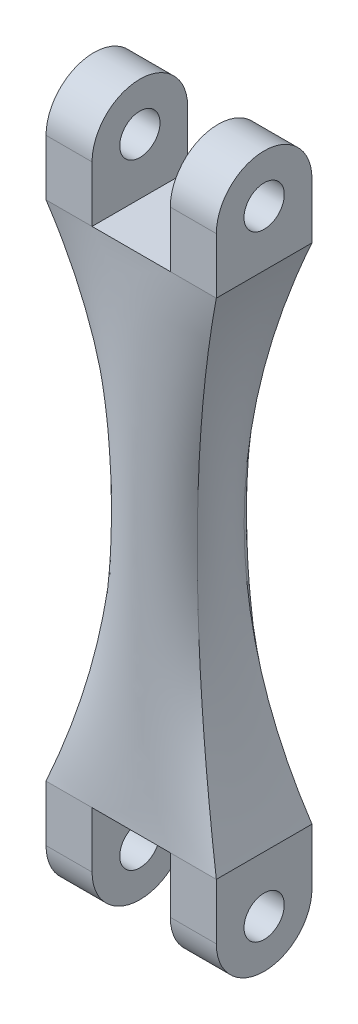
ISO-10303-21;
HEADER;
FILE_DESCRIPTION(('STEP AP214'),'2;1');
FILE_NAME('part.step','',(''),(''),'','','');
FILE_SCHEMA(('AUTOMOTIVE_DESIGN { 1 0 10303 214 1 1 1 1 }'));
ENDSEC;
DATA;
#1=APPLICATION_CONTEXT('core data for automotive mechanical design processes');
#2=APPLICATION_PROTOCOL_DEFINITION('international standard','automotive_design',2000,#1);
#3=PRODUCT_CONTEXT('',#1,'mechanical');
#4=PRODUCT('Part','Part','',(#3));
#5=PRODUCT_RELATED_PRODUCT_CATEGORY('part','',(#4));
#6=PRODUCT_DEFINITION_FORMATION('','',#4);
#7=PRODUCT_DEFINITION_CONTEXT('part definition',#1,'design');
#8=PRODUCT_DEFINITION('design','',#6,#7);
#9=PRODUCT_DEFINITION_SHAPE('','',#8);
#10=(LENGTH_UNIT() NAMED_UNIT(*) SI_UNIT(.MILLI.,.METRE.));
#11=(NAMED_UNIT(*) PLANE_ANGLE_UNIT() SI_UNIT($,.RADIAN.));
#12=(NAMED_UNIT(*) SI_UNIT($,.STERADIAN.) SOLID_ANGLE_UNIT());
#13=UNCERTAINTY_MEASURE_WITH_UNIT(LENGTH_MEASURE(1.E-05),#10,'distance_accuracy_value','');
#14=(GEOMETRIC_REPRESENTATION_CONTEXT(3) GLOBAL_UNCERTAINTY_ASSIGNED_CONTEXT((#13)) GLOBAL_UNIT_ASSIGNED_CONTEXT((#10,
#11,#12)) REPRESENTATION_CONTEXT('',''));
#15=CARTESIAN_POINT('',(0.,0.,0.));
#16=DIRECTION('',(0.,0.,1.));
#17=DIRECTION('',(1.,0.,0.));
#18=AXIS2_PLACEMENT_3D('',#15,#16,#17);
#19=CARTESIAN_POINT('',(0.,0.,0.));
#20=DIRECTION('',(0.,1.,0.));
#21=DIRECTION('',(0.,0.,1.));
#22=AXIS2_PLACEMENT_3D('',#19,#20,#21);
#23=PLANE('',#22);
#24=DIRECTION('',(-1.,0.,0.));
#25=VECTOR('',#24,1.);
#26=CARTESIAN_POINT('',(-4.229,0.,-2.375));
#27=LINE('',#26,#25);
#28=CARTESIAN_POINT('',(1.943,0.,-2.375));
#29=VERTEX_POINT('',#28);
#30=CARTESIAN_POINT('',(-1.943,0.,-2.375));
#31=VERTEX_POINT('',#30);
#32=EDGE_CURVE('E497',#29,#31,#27,.T.);
#33=ORIENTED_EDGE('',*,*,#32,.F.);
#34=DIRECTION('',(0.,0.,-1.));
#35=VECTOR('',#34,1.);
#36=CARTESIAN_POINT('',(1.943,0.,2.375));
#37=LINE('',#36,#35);
#38=CARTESIAN_POINT('',(1.943,0.,2.375));
#39=VERTEX_POINT('',#38);
#40=EDGE_CURVE('E519',#39,#29,#37,.T.);
#41=ORIENTED_EDGE('',*,*,#40,.F.);
#42=DIRECTION('',(1.,0.,0.));
#43=VECTOR('',#42,1.);
#44=CARTESIAN_POINT('',(-4.229,0.,2.375));
#45=LINE('',#44,#43);
#46=CARTESIAN_POINT('',(-1.943,0.,2.375));
#47=VERTEX_POINT('',#46);
#48=EDGE_CURVE('E390',#47,#39,#45,.T.);
#49=ORIENTED_EDGE('',*,*,#48,.F.);
#50=DIRECTION('',(0.,0.,1.));
#51=VECTOR('',#50,1.);
#52=CARTESIAN_POINT('',(-1.943,0.,2.375));
#53=LINE('',#52,#51);
#54=EDGE_CURVE('E764',#31,#47,#53,.T.);
#55=ORIENTED_EDGE('',*,*,#54,.F.);
#56=EDGE_LOOP('',(#33,#41,#49,#55));
#57=FACE_BOUND('',#56,.T.);
#58=ADVANCED_FACE('F83',(#57),#23,.F.);
#59=CARTESIAN_POINT('',(0.,25.,0.));
#60=DIRECTION('',(0.,-1.,0.));
#61=DIRECTION('',(0.,0.,-1.));
#62=AXIS2_PLACEMENT_3D('',#59,#60,#61);
#63=PLANE('',#62);
#64=DIRECTION('',(1.,0.,0.));
#65=VECTOR('',#64,1.);
#66=CARTESIAN_POINT('',(-4.229,25.,2.375));
#67=LINE('',#66,#65);
#68=CARTESIAN_POINT('',(-1.943,25.,2.375));
#69=VERTEX_POINT('',#68);
#70=CARTESIAN_POINT('',(1.943,25.,2.375));
#71=VERTEX_POINT('',#70);
#72=EDGE_CURVE('E94',#69,#71,#67,.T.);
#73=ORIENTED_EDGE('',*,*,#72,.T.);
#74=DIRECTION('',(0.,0.,-1.));
#75=VECTOR('',#74,1.);
#76=CARTESIAN_POINT('',(1.943,25.,2.375));
#77=LINE('',#76,#75);
#78=CARTESIAN_POINT('',(1.943,25.,-2.375));
#79=VERTEX_POINT('',#78);
#80=EDGE_CURVE('E233',#71,#79,#77,.T.);
#81=ORIENTED_EDGE('',*,*,#80,.T.);
#82=DIRECTION('',(-1.,0.,0.));
#83=VECTOR('',#82,1.);
#84=CARTESIAN_POINT('',(-4.229,25.,-2.375));
#85=LINE('',#84,#83);
#86=CARTESIAN_POINT('',(-1.943,25.,-2.375));
#87=VERTEX_POINT('',#86);
#88=EDGE_CURVE('E240',#79,#87,#85,.T.);
#89=ORIENTED_EDGE('',*,*,#88,.T.);
#90=DIRECTION('',(0.,0.,1.));
#91=VECTOR('',#90,1.);
#92=CARTESIAN_POINT('',(-1.943,25.,2.375));
#93=LINE('',#92,#91);
#94=EDGE_CURVE('E331',#87,#69,#93,.T.);
#95=ORIENTED_EDGE('',*,*,#94,.T.);
#96=EDGE_LOOP('',(#73,#81,#89,#95));
#97=FACE_BOUND('',#96,.T.);
#98=ADVANCED_FACE('F85',(#97),#63,.F.);
#99=CARTESIAN_POINT('',(-4.229,0.,2.375));
#100=CARTESIAN_POINT('',(-2.79019274453581,4.16666666666667,1.56696802276485));
#101=CARTESIAN_POINT('',(-1.35138548907162,12.5,0.758936045529698));
#102=CARTESIAN_POINT('',(-2.79019274453581,20.8333333333333,1.56696802276485));
#103=CARTESIAN_POINT('',(-4.229,25.,2.375));
#104=CARTESIAN_POINT('',(-3.87658333333333,0.,2.375));
#105=CARTESIAN_POINT('',(-2.5933830689227,4.16666666666667,1.68482642165011));
#106=CARTESIAN_POINT('',(-1.33801275937234,12.5,1.01533507488279));
#107=CARTESIAN_POINT('',(-2.59338306892271,20.8333333333333,1.68482642165011));
#108=CARTESIAN_POINT('',(-3.87658333333333,25.,2.375));
#109=CARTESIAN_POINT('',(-3.17175,0.,2.375));
#110=CARTESIAN_POINT('',(-2.19976371769648,4.16666666666667,1.92054321942064));
#111=CARTESIAN_POINT('',(-1.21525388275685,12.5,1.45668544278959));
#112=CARTESIAN_POINT('',(-2.19976371769649,20.8333333333333,1.92054321942064));
#113=CARTESIAN_POINT('',(-3.17175,25.,2.375));
#114=CARTESIAN_POINT('',(-1.76208333333333,0.,2.375));
#115=CARTESIAN_POINT('',(-1.28666008100313,4.16666666666667,2.25720422626634));
#116=CARTESIAN_POINT('',(-0.818194682132996,12.5,2.14504896962598));
#117=CARTESIAN_POINT('',(-1.28666008100313,20.8333333333333,2.25720422626634));
#118=CARTESIAN_POINT('',(-1.76208333333333,25.,2.375));
#119=CARTESIAN_POINT('',(0.,0.,2.37499999999999));
#120=CARTESIAN_POINT('',(0.000101211056866504,4.16666666666667,2.45410381952626));
#121=CARTESIAN_POINT('',(0.000205340073713774,12.5,2.52944796547116));
#122=CARTESIAN_POINT('',(0.000101211056865561,20.8333333333333,2.45410381952627));
#123=CARTESIAN_POINT('',(0.,25.,2.37499999999999));
#124=CARTESIAN_POINT('',(1.76208333333333,0.,2.375));
#125=CARTESIAN_POINT('',(1.28646408352315,4.16666666666667,2.25726009368924));
#126=CARTESIAN_POINT('',(0.817793933293085,12.5,2.14515869102929));
#127=CARTESIAN_POINT('',(1.28646408352315,20.8333333333333,2.25726009368925));
#128=CARTESIAN_POINT('',(1.76208333333333,25.,2.375));
#129=CARTESIAN_POINT('',(3.17175,0.,2.375));
#130=CARTESIAN_POINT('',(2.19979581525626,4.16666666666667,1.92055127319065));
#131=CARTESIAN_POINT('',(1.2153326676763,12.5,1.45670517452612));
#132=CARTESIAN_POINT('',(2.19979581525626,20.8333333333333,1.92055127319065));
#133=CARTESIAN_POINT('',(3.17175,25.,2.375));
#134=CARTESIAN_POINT('',(3.87658333333333,0.,2.375));
#135=CARTESIAN_POINT('',(2.59339376810929,4.16666666666667,1.68482910624012));
#136=CARTESIAN_POINT('',(1.33800206018575,12.5,1.01533239029278));
#137=CARTESIAN_POINT('',(2.5933937681093,20.8333333333333,1.68482910624012));
#138=CARTESIAN_POINT('',(3.87658333333333,25.,2.375));
#139=CARTESIAN_POINT('',(4.229,0.,2.375));
#140=CARTESIAN_POINT('',(2.79019274453581,4.16666666666667,1.56696802276485));
#141=CARTESIAN_POINT('',(1.35138548907162,12.5,0.7589360455297));
#142=CARTESIAN_POINT('',(2.79019274453581,20.8333333333333,1.56696802276485));
#143=CARTESIAN_POINT('',(4.229,25.,2.375));
#144=B_SPLINE_SURFACE_WITH_KNOTS('',3,3,((#99,#100,#101,#102,#103),(#104,#105,#106,#107,#108),
(#109,#110,#111,#112,#113),(#114,#115,#116,#117,#118),(#119,#120,#121,#122,#123),(#124,#125,
#126,#127,#128),(#129,#130,#131,#132,#133),(#134,#135,#136,#137,#138),(#139,#140,#141,#142,
#143)),.UNSPECIFIED.,.F.,.F.,.F.,(4,1,1,1,1,1,4),(4,1,4),(0.,0.125,0.25,0.5,0.75,0.875,1.),(0.,
0.5,1.),.UNSPECIFIED.);
#145=CARTESIAN_POINT('',(-4.229,0.,2.375));
#146=VERTEX_POINT('',#145);
#147=EDGE_CURVE('E414',#146,#47,#45,.T.);
#148=DIRECTION('',(1.,0.,0.));
#149=VECTOR('',#148,1.);
#150=CARTESIAN_POINT('',(1.943,0.,2.375));
#151=LINE('',#150,#149);
#152=CARTESIAN_POINT('',(4.229,0.,2.375));
#153=VERTEX_POINT('',#152);
#154=EDGE_CURVE('E420',#39,#153,#151,.T.);
#155=CARTESIAN_POINT('',(4.229,0.,2.375));
#156=CARTESIAN_POINT('',(2.79019274453581,4.16666666666667,1.56696802276485));
#157=CARTESIAN_POINT('',(1.35138548907162,12.5,0.7589360455297));
#158=CARTESIAN_POINT('',(2.79019274453581,20.8333333333333,1.56696802276485));
#159=CARTESIAN_POINT('',(4.229,25.,2.375));
#160=B_SPLINE_CURVE_WITH_KNOTS('',3,(#155,#156,#157,#158,#159),.UNSPECIFIED.,.F.,.F.,(4,1,4),
(0.,0.5,1.),.UNSPECIFIED.);
#161=CARTESIAN_POINT('',(4.229,25.,2.375));
#162=VERTEX_POINT('',#161);
#163=EDGE_CURVE('E374',#153,#162,#160,.T.);
#164=DIRECTION('',(1.,0.,0.));
#165=VECTOR('',#164,1.);
#166=CARTESIAN_POINT('',(1.943,25.,2.375));
#167=LINE('',#166,#165);
#168=EDGE_CURVE('E102',#71,#162,#167,.T.);
#169=CARTESIAN_POINT('',(-4.229,25.,2.375));
#170=VERTEX_POINT('',#169);
#171=EDGE_CURVE('E12',#170,#69,#67,.T.);
#172=CARTESIAN_POINT('',(-4.229,0.,2.375));
#173=CARTESIAN_POINT('',(-2.79019274453581,4.16666666666667,1.56696802276485));
#174=CARTESIAN_POINT('',(-1.35138548907162,12.5,0.758936045529698));
#175=CARTESIAN_POINT('',(-2.79019274453581,20.8333333333333,1.56696802276485));
#176=CARTESIAN_POINT('',(-4.229,25.,2.375));
#177=B_SPLINE_CURVE_WITH_KNOTS('',3,(#172,#173,#174,#175,#176),.UNSPECIFIED.,.F.,.F.,(4,1,4),
(0.,0.5,1.),.UNSPECIFIED.);
#178=EDGE_CURVE('E550',#170,#146,#177,.F.);
#179=ORIENTED_EDGE('',*,*,#147,.T.);
#180=ORIENTED_EDGE('',*,*,#48,.T.);
#181=ORIENTED_EDGE('',*,*,#154,.T.);
#182=ORIENTED_EDGE('',*,*,#163,.T.);
#183=ORIENTED_EDGE('',*,*,#168,.F.);
#184=ORIENTED_EDGE('',*,*,#72,.F.);
#185=ORIENTED_EDGE('',*,*,#171,.F.);
#186=ORIENTED_EDGE('',*,*,#178,.T.);
#187=EDGE_LOOP('',(#179,#180,#181,#182,#183,#184,#185,#186));
#188=FACE_BOUND('',#187,.T.);
#189=ADVANCED_FACE('F343',(#188),#144,.T.);
#190=CARTESIAN_POINT('',(4.229,0.,2.375));
#191=CARTESIAN_POINT('',(2.79019274453581,4.16666666666667,1.56696802276485));
#192=CARTESIAN_POINT('',(1.35138548907162,12.5,0.7589360455297));
#193=CARTESIAN_POINT('',(2.79019274453581,20.8333333333333,1.56696802276485));
#194=CARTESIAN_POINT('',(4.229,25.,2.375));
#195=CARTESIAN_POINT('',(4.229,0.,0.791666666666667));
#196=CARTESIAN_POINT('',(2.79019274453581,4.16666666666667,0.52232267425495));
#197=CARTESIAN_POINT('',(2.16250920059252,12.5,0.359268898872493));
#198=CARTESIAN_POINT('',(2.79019274453581,20.8333333333333,0.52232267425495));
#199=CARTESIAN_POINT('',(4.229,25.,0.791666666666667));
#200=CARTESIAN_POINT('',(4.229,0.,-0.791666666666667));
#201=CARTESIAN_POINT('',(2.79019274453581,4.16666666666667,-0.52232267425495));
#202=CARTESIAN_POINT('',(2.16250920059252,12.5,-0.359268898872492));
#203=CARTESIAN_POINT('',(2.79019274453581,20.8333333333333,-0.52232267425495));
#204=CARTESIAN_POINT('',(4.229,25.,-0.791666666666667));
#205=CARTESIAN_POINT('',(4.229,0.,-2.375));
#206=CARTESIAN_POINT('',(2.79019274453581,4.16666666666667,-1.56696802276485));
#207=CARTESIAN_POINT('',(1.35138548907162,12.5,-0.7589360455297));
#208=CARTESIAN_POINT('',(2.79019274453581,20.8333333333333,-1.56696802276485));
#209=CARTESIAN_POINT('',(4.229,25.,-2.375));
#210=B_SPLINE_SURFACE_WITH_KNOTS('',3,3,((#190,#191,#192,#193,#194),(#195,#196,#197,#198,#199),
(#200,#201,#202,#203,#204),(#205,#206,#207,#208,#209)),.UNSPECIFIED.,.F.,.F.,.F.,(4,4),(4,1,4),
(0.,1.),(0.,0.5,1.),.UNSPECIFIED.);
#211=DIRECTION('',(0.,0.,-1.));
#212=VECTOR('',#211,1.);
#213=CARTESIAN_POINT('',(4.229,0.,-2.375));
#214=LINE('',#213,#212);
#215=CARTESIAN_POINT('',(4.229,0.,-2.375));
#216=VERTEX_POINT('',#215);
#217=EDGE_CURVE('E419',#153,#216,#214,.T.);
#218=CARTESIAN_POINT('',(4.229,0.,-2.375));
#219=CARTESIAN_POINT('',(2.79019274453581,4.16666666666667,-1.56696802276485));
#220=CARTESIAN_POINT('',(1.35138548907162,12.5,-0.7589360455297));
#221=CARTESIAN_POINT('',(2.79019274453581,20.8333333333333,-1.56696802276485));
#222=CARTESIAN_POINT('',(4.229,25.,-2.375));
#223=B_SPLINE_CURVE_WITH_KNOTS('',3,(#218,#219,#220,#221,#222),.UNSPECIFIED.,.F.,.F.,(4,1,4),
(0.,0.5,1.),.UNSPECIFIED.);
#224=CARTESIAN_POINT('',(4.229,25.,-2.375));
#225=VERTEX_POINT('',#224);
#226=EDGE_CURVE('E619',#216,#225,#223,.T.);
#227=DIRECTION('',(0.,0.,-1.));
#228=VECTOR('',#227,1.);
#229=CARTESIAN_POINT('',(4.229,25.,2.375));
#230=LINE('',#229,#228);
#231=EDGE_CURVE('E641',#162,#225,#230,.T.);
#232=ORIENTED_EDGE('',*,*,#217,.T.);
#233=ORIENTED_EDGE('',*,*,#226,.T.);
#234=ORIENTED_EDGE('',*,*,#231,.F.);
#235=ORIENTED_EDGE('',*,*,#163,.F.);
#236=EDGE_LOOP('',(#232,#233,#234,#235));
#237=FACE_BOUND('',#236,.T.);
#238=ADVANCED_FACE('F355',(#237),#210,.T.);
#239=CARTESIAN_POINT('',(-4.229,0.,-2.375));
#240=CARTESIAN_POINT('',(-2.79019274453581,4.16666666666667,-1.56696802276485));
#241=CARTESIAN_POINT('',(-1.35138548907162,12.5,-0.758936045529699));
#242=CARTESIAN_POINT('',(-2.79019274453581,20.8333333333333,-1.56696802276485));
#243=CARTESIAN_POINT('',(-4.229,25.,-2.375));
#244=CARTESIAN_POINT('',(-4.229,0.,-0.791666666666667));
#245=CARTESIAN_POINT('',(-2.79019274453581,4.16666666666667,-0.52232267425495));
#246=CARTESIAN_POINT('',(-2.16250920059252,12.5,-0.359268898872493));
#247=CARTESIAN_POINT('',(-2.79019274453581,20.8333333333333,-0.52232267425495));
#248=CARTESIAN_POINT('',(-4.229,25.,-0.791666666666667));
#249=CARTESIAN_POINT('',(-4.229,0.,0.791666666666667));
#250=CARTESIAN_POINT('',(-2.79019274453581,4.16666666666667,0.522322674254949));
#251=CARTESIAN_POINT('',(-2.16250920059252,12.5,0.359268898872492));
#252=CARTESIAN_POINT('',(-2.79019274453581,20.8333333333333,0.52232267425495));
#253=CARTESIAN_POINT('',(-4.229,25.,0.791666666666667));
#254=CARTESIAN_POINT('',(-4.229,0.,2.375));
#255=CARTESIAN_POINT('',(-2.79019274453581,4.16666666666667,1.56696802276485));
#256=CARTESIAN_POINT('',(-1.35138548907162,12.5,0.758936045529698));
#257=CARTESIAN_POINT('',(-2.79019274453581,20.8333333333333,1.56696802276485));
#258=CARTESIAN_POINT('',(-4.229,25.,2.375));
#259=B_SPLINE_SURFACE_WITH_KNOTS('',3,3,((#239,#240,#241,#242,#243),(#244,#245,#246,#247,#248),
(#249,#250,#251,#252,#253),(#254,#255,#256,#257,#258)),.UNSPECIFIED.,.F.,.F.,.F.,(4,4),(4,1,4),
(0.,1.),(0.,0.5,1.),.UNSPECIFIED.);
#260=DIRECTION('',(0.,0.,1.));
#261=VECTOR('',#260,1.);
#262=CARTESIAN_POINT('',(-4.229,0.,-2.375));
#263=LINE('',#262,#261);
#264=CARTESIAN_POINT('',(-4.229,0.,-2.375));
#265=VERTEX_POINT('',#264);
#266=EDGE_CURVE('E488',#265,#146,#263,.T.);
#267=DIRECTION('',(0.,0.,1.));
#268=VECTOR('',#267,1.);
#269=CARTESIAN_POINT('',(-4.229,25.,2.375));
#270=LINE('',#269,#268);
#271=CARTESIAN_POINT('',(-4.229,25.,-2.375));
#272=VERTEX_POINT('',#271);
#273=EDGE_CURVE('E301',#272,#170,#270,.T.);
#274=CARTESIAN_POINT('',(-4.229,0.,-2.375));
#275=CARTESIAN_POINT('',(-2.79019274453581,4.16666666666667,-1.56696802276485));
#276=CARTESIAN_POINT('',(-1.35138548907162,12.5,-0.758936045529699));
#277=CARTESIAN_POINT('',(-2.79019274453581,20.8333333333333,-1.56696802276485));
#278=CARTESIAN_POINT('',(-4.229,25.,-2.375));
#279=B_SPLINE_CURVE_WITH_KNOTS('',3,(#274,#275,#276,#277,#278),.UNSPECIFIED.,.F.,.F.,(4,1,4),
(0.,0.5,1.),.UNSPECIFIED.);
#280=EDGE_CURVE('E630',#265,#272,#279,.T.);
#281=ORIENTED_EDGE('',*,*,#266,.T.);
#282=ORIENTED_EDGE('',*,*,#178,.F.);
#283=ORIENTED_EDGE('',*,*,#273,.F.);
#284=ORIENTED_EDGE('',*,*,#280,.F.);
#285=EDGE_LOOP('',(#281,#282,#283,#284));
#286=FACE_BOUND('',#285,.T.);
#287=ADVANCED_FACE('F604',(#286),#259,.T.);
#288=CARTESIAN_POINT('',(4.229,0.,-2.375));
#289=CARTESIAN_POINT('',(2.79019274453581,4.16666666666667,-1.56696802276485));
#290=CARTESIAN_POINT('',(1.35138548907162,12.5,-0.7589360455297));
#291=CARTESIAN_POINT('',(2.79019274453581,20.8333333333333,-1.56696802276485));
#292=CARTESIAN_POINT('',(4.229,25.,-2.375));
#293=CARTESIAN_POINT('',(3.87658333333333,0.,-2.375));
#294=CARTESIAN_POINT('',(2.5933830689227,4.16666666666667,-1.68482642165011));
#295=CARTESIAN_POINT('',(1.33801275937234,12.5,-1.01533507488279));
#296=CARTESIAN_POINT('',(2.5933830689227,20.8333333333333,-1.68482642165011));
#297=CARTESIAN_POINT('',(3.87658333333333,25.,-2.375));
#298=CARTESIAN_POINT('',(3.17175,0.,-2.375));
#299=CARTESIAN_POINT('',(2.19976371769648,4.16666666666667,-1.92054321942064));
#300=CARTESIAN_POINT('',(1.21525388275685,12.5,-1.45668544278959));
#301=CARTESIAN_POINT('',(2.19976371769648,20.8333333333333,-1.92054321942064));
#302=CARTESIAN_POINT('',(3.17175,25.,-2.375));
#303=CARTESIAN_POINT('',(1.76208333333333,0.,-2.375));
#304=CARTESIAN_POINT('',(1.28666008100314,4.16666666666667,-2.25720422626633));
#305=CARTESIAN_POINT('',(0.818194682133002,12.5,-2.14504896962598));
#306=CARTESIAN_POINT('',(1.28666008100313,20.8333333333333,-2.25720422626633));
#307=CARTESIAN_POINT('',(1.76208333333333,25.,-2.375));
#308=CARTESIAN_POINT('',(0.,0.,-2.37499999999999));
#309=CARTESIAN_POINT('',(-0.000101211056870556,4.16666666666666,-2.45410381952627));
#310=CARTESIAN_POINT('',(-0.000205340073719695,12.5,-2.52944796547117));
#311=CARTESIAN_POINT('',(-0.000101211056869614,20.8333333333333,-2.45410381952627));
#312=CARTESIAN_POINT('',(0.,25.,-2.37499999999999));
#313=CARTESIAN_POINT('',(-1.76208333333333,0.,-2.375));
#314=CARTESIAN_POINT('',(-1.28646408352314,4.16666666666667,-2.25726009368924));
#315=CARTESIAN_POINT('',(-0.817793933293085,12.5,-2.14515869102929));
#316=CARTESIAN_POINT('',(-1.28646408352315,20.8333333333333,-2.25726009368925));
#317=CARTESIAN_POINT('',(-1.76208333333333,25.,-2.375));
#318=CARTESIAN_POINT('',(-3.17175,0.,-2.375));
#319=CARTESIAN_POINT('',(-2.19979581525626,4.16666666666666,-1.92055127319065));
#320=CARTESIAN_POINT('',(-1.2153326676763,12.5,-1.45670517452612));
#321=CARTESIAN_POINT('',(-2.19979581525626,20.8333333333333,-1.92055127319065));
#322=CARTESIAN_POINT('',(-3.17175,25.,-2.375));
#323=CARTESIAN_POINT('',(-3.87658333333333,0.,-2.375));
#324=CARTESIAN_POINT('',(-2.5933937681093,4.16666666666667,-1.68482910624012));
#325=CARTESIAN_POINT('',(-1.33800206018575,12.5,-1.01533239029278));
#326=CARTESIAN_POINT('',(-2.59339376810929,20.8333333333333,-1.68482910624012));
#327=CARTESIAN_POINT('',(-3.87658333333333,25.,-2.375));
#328=CARTESIAN_POINT('',(-4.229,0.,-2.375));
#329=CARTESIAN_POINT('',(-2.79019274453581,4.16666666666667,-1.56696802276485));
#330=CARTESIAN_POINT('',(-1.35138548907162,12.5,-0.758936045529699));
#331=CARTESIAN_POINT('',(-2.79019274453581,20.8333333333333,-1.56696802276485));
#332=CARTESIAN_POINT('',(-4.229,25.,-2.375));
#333=B_SPLINE_SURFACE_WITH_KNOTS('',3,3,((#288,#289,#290,#291,#292),(#293,#294,#295,#296,#297),
(#298,#299,#300,#301,#302),(#303,#304,#305,#306,#307),(#308,#309,#310,#311,#312),(#313,#314,
#315,#316,#317),(#318,#319,#320,#321,#322),(#323,#324,#325,#326,#327),(#328,#329,#330,#331,
#332)),.UNSPECIFIED.,.F.,.F.,.F.,(4,1,1,1,1,1,4),(4,1,4),(0.,0.125,0.25,0.5,0.75,0.875,1.),(0.,
0.5,1.),.UNSPECIFIED.);
#334=EDGE_CURVE('E529',#216,#29,#27,.T.);
#335=DIRECTION('',(-1.,0.,0.));
#336=VECTOR('',#335,1.);
#337=CARTESIAN_POINT('',(-1.943,0.,-2.375));
#338=LINE('',#337,#336);
#339=EDGE_CURVE('E783',#31,#265,#338,.T.);
#340=DIRECTION('',(-1.,0.,0.));
#341=VECTOR('',#340,1.);
#342=CARTESIAN_POINT('',(-1.943,25.,-2.375));
#343=LINE('',#342,#341);
#344=EDGE_CURVE('E721',#87,#272,#343,.T.);
#345=EDGE_CURVE('E230',#225,#79,#85,.T.);
#346=ORIENTED_EDGE('',*,*,#334,.T.);
#347=ORIENTED_EDGE('',*,*,#32,.T.);
#348=ORIENTED_EDGE('',*,*,#339,.T.);
#349=ORIENTED_EDGE('',*,*,#280,.T.);
#350=ORIENTED_EDGE('',*,*,#344,.F.);
#351=ORIENTED_EDGE('',*,*,#88,.F.);
#352=ORIENTED_EDGE('',*,*,#345,.F.);
#353=ORIENTED_EDGE('',*,*,#226,.F.);
#354=EDGE_LOOP('',(#346,#347,#348,#349,#350,#351,#352,#353));
#355=FACE_BOUND('',#354,.T.);
#356=ADVANCED_FACE('F472',(#355),#333,.T.);
#357=CARTESIAN_POINT('',(-1.943,-2.775,0.));
#358=DIRECTION('',(1.,0.,0.));
#359=DIRECTION('',(0.,0.,-1.));
#360=AXIS2_PLACEMENT_3D('',#357,#358,#359);
#361=PLANE('',#360);
#362=CARTESIAN_POINT('',(-1.943,-2.775,0.));
#363=DIRECTION('',(1.,0.,0.));
#364=DIRECTION('',(0.,0.,-1.));
#365=AXIS2_PLACEMENT_3D('',#362,#363,#364);
#366=CIRCLE('',#365,2.375);
#367=CARTESIAN_POINT('',(-1.943,-2.775,2.375));
#368=VERTEX_POINT('',#367);
#369=CARTESIAN_POINT('',(-1.943,-2.775,-2.375));
#370=VERTEX_POINT('',#369);
#371=EDGE_CURVE('E756',#368,#370,#366,.T.);
#372=ORIENTED_EDGE('',*,*,#371,.T.);
#373=DIRECTION('',(0.,1.,0.));
#374=VECTOR('',#373,1.);
#375=CARTESIAN_POINT('',(-1.943,-2.775,-2.375));
#376=LINE('',#375,#374);
#377=EDGE_CURVE('E760',#370,#31,#376,.T.);
#378=ORIENTED_EDGE('',*,*,#377,.T.);
#379=ORIENTED_EDGE('',*,*,#54,.T.);
#380=DIRECTION('',(0.,-1.,0.));
#381=VECTOR('',#380,1.);
#382=CARTESIAN_POINT('',(-1.943,-2.775,2.375));
#383=LINE('',#382,#381);
#384=EDGE_CURVE('E767',#47,#368,#383,.T.);
#385=ORIENTED_EDGE('',*,*,#384,.T.);
#386=EDGE_LOOP('',(#372,#378,#379,#385));
#387=FACE_BOUND('',#386,.T.);
#388=CARTESIAN_POINT('',(-1.943,-2.775,0.));
#389=DIRECTION('',(1.,0.,0.));
#390=DIRECTION('',(0.,0.,-1.));
#391=AXIS2_PLACEMENT_3D('',#388,#389,#390);
#392=CIRCLE('',#391,1.);
#393=CARTESIAN_POINT('',(-1.943,-2.775,-0.999999999999999));
#394=VERTEX_POINT('',#393);
#395=EDGE_CURVE('E748',#394,#394,#392,.T.);
#396=ORIENTED_EDGE('',*,*,#395,.F.);
#397=EDGE_LOOP('',(#396));
#398=FACE_BOUND('',#397,.T.);
#399=ADVANCED_FACE('F468',(#387,#398),#361,.T.);
#400=CARTESIAN_POINT('',(-4.229,-2.775,0.));
#401=DIRECTION('',(1.,0.,0.));
#402=DIRECTION('',(0.,0.,-1.));
#403=AXIS2_PLACEMENT_3D('',#400,#401,#402);
#404=PLANE('',#403);
#405=CARTESIAN_POINT('',(-4.229,-2.775,0.));
#406=DIRECTION('',(1.,0.,0.));
#407=DIRECTION('',(0.,0.,-1.));
#408=AXIS2_PLACEMENT_3D('',#405,#406,#407);
#409=CIRCLE('',#408,2.375);
#410=CARTESIAN_POINT('',(-4.229,-2.775,2.375));
#411=VERTEX_POINT('',#410);
#412=CARTESIAN_POINT('',(-4.229,-2.775,-2.375));
#413=VERTEX_POINT('',#412);
#414=EDGE_CURVE('E752',#411,#413,#409,.T.);
#415=ORIENTED_EDGE('',*,*,#414,.F.);
#416=DIRECTION('',(0.,-1.,0.));
#417=VECTOR('',#416,1.);
#418=CARTESIAN_POINT('',(-4.229,-2.775,2.375));
#419=LINE('',#418,#417);
#420=EDGE_CURVE('E498',#146,#411,#419,.T.);
#421=ORIENTED_EDGE('',*,*,#420,.F.);
#422=ORIENTED_EDGE('',*,*,#266,.F.);
#423=DIRECTION('',(0.,1.,0.));
#424=VECTOR('',#423,1.);
#425=CARTESIAN_POINT('',(-4.229,-2.775,-2.375));
#426=LINE('',#425,#424);
#427=EDGE_CURVE('E788',#413,#265,#426,.T.);
#428=ORIENTED_EDGE('',*,*,#427,.F.);
#429=EDGE_LOOP('',(#415,#421,#422,#428));
#430=FACE_BOUND('',#429,.T.);
#431=CARTESIAN_POINT('',(-4.229,-2.775,0.));
#432=DIRECTION('',(1.,0.,0.));
#433=DIRECTION('',(0.,0.,-1.));
#434=AXIS2_PLACEMENT_3D('',#431,#432,#433);
#435=CIRCLE('',#434,1.);
#436=CARTESIAN_POINT('',(-4.229,-2.775,-0.999999999999999));
#437=VERTEX_POINT('',#436);
#438=EDGE_CURVE('E747',#437,#437,#435,.T.);
#439=ORIENTED_EDGE('',*,*,#438,.T.);
#440=EDGE_LOOP('',(#439));
#441=FACE_BOUND('',#440,.T.);
#442=ADVANCED_FACE('F471',(#430,#441),#404,.F.);
#443=CARTESIAN_POINT('',(-1.943,-2.775,0.));
#444=DIRECTION('',(-1.,0.,0.));
#445=DIRECTION('',(0.,0.,1.));
#446=AXIS2_PLACEMENT_3D('',#443,#444,#445);
#447=CYLINDRICAL_SURFACE('',#446,2.375);
#448=ORIENTED_EDGE('',*,*,#414,.T.);
#449=DIRECTION('',(-1.,0.,0.));
#450=VECTOR('',#449,1.);
#451=CARTESIAN_POINT('',(-1.943,-2.775,-2.375));
#452=LINE('',#451,#450);
#453=EDGE_CURVE('E436',#370,#413,#452,.T.);
#454=ORIENTED_EDGE('',*,*,#453,.F.);
#455=ORIENTED_EDGE('',*,*,#371,.F.);
#456=DIRECTION('',(-1.,0.,0.));
#457=VECTOR('',#456,1.);
#458=CARTESIAN_POINT('',(-1.943,-2.775,2.375));
#459=LINE('',#458,#457);
#460=EDGE_CURVE('E770',#368,#411,#459,.T.);
#461=ORIENTED_EDGE('',*,*,#460,.T.);
#462=EDGE_LOOP('',(#448,#454,#455,#461));
#463=FACE_BOUND('',#462,.T.);
#464=ADVANCED_FACE('F477',(#463),#447,.T.);
#465=CARTESIAN_POINT('',(-1.943,-2.775,-2.375));
#466=DIRECTION('',(0.,0.,1.));
#467=DIRECTION('',(0.,-1.,0.));
#468=AXIS2_PLACEMENT_3D('',#465,#466,#467);
#469=PLANE('',#468);
#470=ORIENTED_EDGE('',*,*,#427,.T.);
#471=ORIENTED_EDGE('',*,*,#339,.F.);
#472=ORIENTED_EDGE('',*,*,#377,.F.);
#473=ORIENTED_EDGE('',*,*,#453,.T.);
#474=EDGE_LOOP('',(#470,#471,#472,#473));
#475=FACE_BOUND('',#474,.T.);
#476=ADVANCED_FACE('F805',(#475),#469,.F.);
#477=CARTESIAN_POINT('',(-1.943,-2.775,2.375));
#478=DIRECTION('',(0.,0.,-1.));
#479=DIRECTION('',(0.,1.,0.));
#480=AXIS2_PLACEMENT_3D('',#477,#478,#479);
#481=PLANE('',#480);
#482=ORIENTED_EDGE('',*,*,#420,.T.);
#483=ORIENTED_EDGE('',*,*,#460,.F.);
#484=ORIENTED_EDGE('',*,*,#384,.F.);
#485=ORIENTED_EDGE('',*,*,#147,.F.);
#486=EDGE_LOOP('',(#482,#483,#484,#485));
#487=FACE_BOUND('',#486,.T.);
#488=ADVANCED_FACE('F466',(#487),#481,.F.);
#489=CARTESIAN_POINT('',(-1.943,-2.775,0.));
#490=DIRECTION('',(-1.,0.,0.));
#491=DIRECTION('',(0.,0.,1.));
#492=AXIS2_PLACEMENT_3D('',#489,#490,#491);
#493=CYLINDRICAL_SURFACE('',#492,1.);
#494=ORIENTED_EDGE('',*,*,#395,.T.);
#495=EDGE_LOOP('',(#494));
#496=FACE_BOUND('',#495,.T.);
#497=ORIENTED_EDGE('',*,*,#438,.F.);
#498=EDGE_LOOP('',(#497));
#499=FACE_BOUND('',#498,.T.);
#500=ADVANCED_FACE('F462',(#496,#499),#493,.F.);
#501=CARTESIAN_POINT('',(1.943,-2.775,0.));
#502=DIRECTION('',(-1.,0.,0.));
#503=DIRECTION('',(0.,0.,1.));
#504=AXIS2_PLACEMENT_3D('',#501,#502,#503);
#505=PLANE('',#504);
#506=CARTESIAN_POINT('',(1.943,-2.775,0.));
#507=DIRECTION('',(-1.,0.,0.));
#508=DIRECTION('',(0.,0.,1.));
#509=AXIS2_PLACEMENT_3D('',#506,#507,#508);
#510=CIRCLE('',#509,2.375);
#511=CARTESIAN_POINT('',(1.943,-2.775,-2.375));
#512=VERTEX_POINT('',#511);
#513=CARTESIAN_POINT('',(1.943,-2.775,2.375));
#514=VERTEX_POINT('',#513);
#515=EDGE_CURVE('E544',#512,#514,#510,.T.);
#516=ORIENTED_EDGE('',*,*,#515,.T.);
#517=DIRECTION('',(0.,1.,0.));
#518=VECTOR('',#517,1.);
#519=CARTESIAN_POINT('',(1.943,-2.775,2.375));
#520=LINE('',#519,#518);
#521=EDGE_CURVE('E443',#514,#39,#520,.T.);
#522=ORIENTED_EDGE('',*,*,#521,.T.);
#523=ORIENTED_EDGE('',*,*,#40,.T.);
#524=DIRECTION('',(0.,-1.,0.));
#525=VECTOR('',#524,1.);
#526=CARTESIAN_POINT('',(1.943,0.,-2.375));
#527=LINE('',#526,#525);
#528=EDGE_CURVE('E516',#29,#512,#527,.T.);
#529=ORIENTED_EDGE('',*,*,#528,.T.);
#530=EDGE_LOOP('',(#516,#522,#523,#529));
#531=FACE_BOUND('',#530,.T.);
#532=CARTESIAN_POINT('',(1.943,-2.775,0.));
#533=DIRECTION('',(-1.,0.,0.));
#534=DIRECTION('',(0.,0.,1.));
#535=AXIS2_PLACEMENT_3D('',#532,#533,#534);
#536=CIRCLE('',#535,1.);
#537=CARTESIAN_POINT('',(1.943,-2.775,1.));
#538=VERTEX_POINT('',#537);
#539=EDGE_CURVE('E727',#538,#538,#536,.T.);
#540=ORIENTED_EDGE('',*,*,#539,.F.);
#541=EDGE_LOOP('',(#540));
#542=FACE_BOUND('',#541,.T.);
#543=ADVANCED_FACE('F465',(#531,#542),#505,.T.);
#544=CARTESIAN_POINT('',(4.229,-2.775,0.));
#545=DIRECTION('',(-1.,0.,0.));
#546=DIRECTION('',(0.,0.,1.));
#547=AXIS2_PLACEMENT_3D('',#544,#545,#546);
#548=PLANE('',#547);
#549=CARTESIAN_POINT('',(4.229,-2.775,0.));
#550=DIRECTION('',(-1.,0.,0.));
#551=DIRECTION('',(0.,0.,1.));
#552=AXIS2_PLACEMENT_3D('',#549,#550,#551);
#553=CIRCLE('',#552,2.375);
#554=CARTESIAN_POINT('',(4.229,-2.775,-2.375));
#555=VERTEX_POINT('',#554);
#556=CARTESIAN_POINT('',(4.229,-2.775,2.375));
#557=VERTEX_POINT('',#556);
#558=EDGE_CURVE('E731',#555,#557,#553,.T.);
#559=ORIENTED_EDGE('',*,*,#558,.F.);
#560=DIRECTION('',(0.,-1.,0.));
#561=VECTOR('',#560,1.);
#562=CARTESIAN_POINT('',(4.229,0.,-2.375));
#563=LINE('',#562,#561);
#564=EDGE_CURVE('E536',#216,#555,#563,.T.);
#565=ORIENTED_EDGE('',*,*,#564,.F.);
#566=ORIENTED_EDGE('',*,*,#217,.F.);
#567=DIRECTION('',(0.,1.,0.));
#568=VECTOR('',#567,1.);
#569=CARTESIAN_POINT('',(4.229,-2.775,2.375));
#570=LINE('',#569,#568);
#571=EDGE_CURVE('E545',#557,#153,#570,.T.);
#572=ORIENTED_EDGE('',*,*,#571,.F.);
#573=EDGE_LOOP('',(#559,#565,#566,#572));
#574=FACE_BOUND('',#573,.T.);
#575=CARTESIAN_POINT('',(4.229,-2.775,0.));
#576=DIRECTION('',(-1.,0.,0.));
#577=DIRECTION('',(0.,0.,1.));
#578=AXIS2_PLACEMENT_3D('',#575,#576,#577);
#579=CIRCLE('',#578,1.);
#580=CARTESIAN_POINT('',(4.229,-2.775,1.));
#581=VERTEX_POINT('',#580);
#582=EDGE_CURVE('E726',#581,#581,#579,.T.);
#583=ORIENTED_EDGE('',*,*,#582,.T.);
#584=EDGE_LOOP('',(#583));
#585=FACE_BOUND('',#584,.T.);
#586=ADVANCED_FACE('F460',(#574,#585),#548,.F.);
#587=CARTESIAN_POINT('',(1.943,-2.775,0.));
#588=DIRECTION('',(1.,0.,0.));
#589=DIRECTION('',(0.,0.,-1.));
#590=AXIS2_PLACEMENT_3D('',#587,#588,#589);
#591=CYLINDRICAL_SURFACE('',#590,2.375);
#592=ORIENTED_EDGE('',*,*,#558,.T.);
#593=DIRECTION('',(1.,0.,0.));
#594=VECTOR('',#593,1.);
#595=CARTESIAN_POINT('',(1.943,-2.775,2.375));
#596=LINE('',#595,#594);
#597=EDGE_CURVE('E424',#514,#557,#596,.T.);
#598=ORIENTED_EDGE('',*,*,#597,.F.);
#599=ORIENTED_EDGE('',*,*,#515,.F.);
#600=DIRECTION('',(1.,0.,0.));
#601=VECTOR('',#600,1.);
#602=CARTESIAN_POINT('',(1.943,-2.775,-2.375));
#603=LINE('',#602,#601);
#604=EDGE_CURVE('E425',#512,#555,#603,.T.);
#605=ORIENTED_EDGE('',*,*,#604,.T.);
#606=EDGE_LOOP('',(#592,#598,#599,#605));
#607=FACE_BOUND('',#606,.T.);
#608=ADVANCED_FACE('F455',(#607),#591,.T.);
#609=CARTESIAN_POINT('',(1.943,-2.775,2.375));
#610=DIRECTION('',(0.,0.,-1.));
#611=DIRECTION('',(0.,1.,0.));
#612=AXIS2_PLACEMENT_3D('',#609,#610,#611);
#613=PLANE('',#612);
#614=ORIENTED_EDGE('',*,*,#571,.T.);
#615=ORIENTED_EDGE('',*,*,#154,.F.);
#616=ORIENTED_EDGE('',*,*,#521,.F.);
#617=ORIENTED_EDGE('',*,*,#597,.T.);
#618=EDGE_LOOP('',(#614,#615,#616,#617));
#619=FACE_BOUND('',#618,.T.);
#620=ADVANCED_FACE('F444',(#619),#613,.F.);
#621=CARTESIAN_POINT('',(1.943,0.,-2.375));
#622=DIRECTION('',(0.,0.,1.));
#623=DIRECTION('',(0.,-1.,0.));
#624=AXIS2_PLACEMENT_3D('',#621,#622,#623);
#625=PLANE('',#624);
#626=ORIENTED_EDGE('',*,*,#564,.T.);
#627=ORIENTED_EDGE('',*,*,#604,.F.);
#628=ORIENTED_EDGE('',*,*,#528,.F.);
#629=ORIENTED_EDGE('',*,*,#334,.F.);
#630=EDGE_LOOP('',(#626,#627,#628,#629));
#631=FACE_BOUND('',#630,.T.);
#632=ADVANCED_FACE('F454',(#631),#625,.F.);
#633=CARTESIAN_POINT('',(1.943,-2.775,0.));
#634=DIRECTION('',(1.,0.,0.));
#635=DIRECTION('',(0.,0.,-1.));
#636=AXIS2_PLACEMENT_3D('',#633,#634,#635);
#637=CYLINDRICAL_SURFACE('',#636,1.);
#638=ORIENTED_EDGE('',*,*,#539,.T.);
#639=EDGE_LOOP('',(#638));
#640=FACE_BOUND('',#639,.T.);
#641=ORIENTED_EDGE('',*,*,#582,.F.);
#642=EDGE_LOOP('',(#641));
#643=FACE_BOUND('',#642,.T.);
#644=ADVANCED_FACE('F567',(#640,#643),#637,.F.);
#645=CARTESIAN_POINT('',(-1.943,27.775,0.));
#646=DIRECTION('',(-1.,0.,0.));
#647=DIRECTION('',(0.,0.,1.));
#648=AXIS2_PLACEMENT_3D('',#645,#646,#647);
#649=CYLINDRICAL_SURFACE('',#648,2.375);
#650=CARTESIAN_POINT('',(-4.229,27.775,0.));
#651=DIRECTION('',(-1.,0.,0.));
#652=DIRECTION('',(0.,0.,-1.));
#653=AXIS2_PLACEMENT_3D('',#650,#651,#652);
#654=CIRCLE('',#653,2.375);
#655=CARTESIAN_POINT('',(-4.229,27.775,2.375));
#656=VERTEX_POINT('',#655);
#657=CARTESIAN_POINT('',(-4.229,27.775,-2.375));
#658=VERTEX_POINT('',#657);
#659=EDGE_CURVE('E298',#656,#658,#654,.T.);
#660=ORIENTED_EDGE('',*,*,#659,.F.);
#661=DIRECTION('',(-1.,0.,0.));
#662=VECTOR('',#661,1.);
#663=CARTESIAN_POINT('',(-1.943,27.775,2.375));
#664=LINE('',#663,#662);
#665=CARTESIAN_POINT('',(-1.943,27.775,2.375));
#666=VERTEX_POINT('',#665);
#667=EDGE_CURVE('E723',#666,#656,#664,.T.);
#668=ORIENTED_EDGE('',*,*,#667,.F.);
#669=CARTESIAN_POINT('',(-1.943,27.775,0.));
#670=DIRECTION('',(-1.,0.,0.));
#671=DIRECTION('',(0.,0.,-1.));
#672=AXIS2_PLACEMENT_3D('',#669,#670,#671);
#673=CIRCLE('',#672,2.375);
#674=CARTESIAN_POINT('',(-1.943,27.775,-2.375));
#675=VERTEX_POINT('',#674);
#676=EDGE_CURVE('E710',#666,#675,#673,.T.);
#677=ORIENTED_EDGE('',*,*,#676,.T.);
#678=DIRECTION('',(-1.,0.,0.));
#679=VECTOR('',#678,1.);
#680=CARTESIAN_POINT('',(-1.943,27.775,-2.375));
#681=LINE('',#680,#679);
#682=EDGE_CURVE('E718',#675,#658,#681,.T.);
#683=ORIENTED_EDGE('',*,*,#682,.T.);
#684=EDGE_LOOP('',(#660,#668,#677,#683));
#685=FACE_BOUND('',#684,.T.);
#686=ADVANCED_FACE('F570',(#685),#649,.T.);
#687=CARTESIAN_POINT('',(-1.943,27.775,2.375));
#688=DIRECTION('',(0.,0.,1.));
#689=DIRECTION('',(0.,-1.,0.));
#690=AXIS2_PLACEMENT_3D('',#687,#688,#689);
#691=PLANE('',#690);
#692=DIRECTION('',(0.,1.,0.));
#693=VECTOR('',#692,1.);
#694=CARTESIAN_POINT('',(-4.229,27.775,2.375));
#695=LINE('',#694,#693);
#696=EDGE_CURVE('E288',#170,#656,#695,.T.);
#697=ORIENTED_EDGE('',*,*,#696,.F.);
#698=ORIENTED_EDGE('',*,*,#171,.T.);
#699=DIRECTION('',(0.,1.,0.));
#700=VECTOR('',#699,1.);
#701=CARTESIAN_POINT('',(-1.943,27.775,2.375));
#702=LINE('',#701,#700);
#703=EDGE_CURVE('E111',#69,#666,#702,.T.);
#704=ORIENTED_EDGE('',*,*,#703,.T.);
#705=ORIENTED_EDGE('',*,*,#667,.T.);
#706=EDGE_LOOP('',(#697,#698,#704,#705));
#707=FACE_BOUND('',#706,.T.);
#708=ADVANCED_FACE('F573',(#707),#691,.T.);
#709=CARTESIAN_POINT('',(-1.943,27.775,-2.375));
#710=DIRECTION('',(0.,0.,-1.));
#711=DIRECTION('',(0.,1.,0.));
#712=AXIS2_PLACEMENT_3D('',#709,#710,#711);
#713=PLANE('',#712);
#714=DIRECTION('',(0.,-1.,0.));
#715=VECTOR('',#714,1.);
#716=CARTESIAN_POINT('',(-4.229,27.775,-2.375));
#717=LINE('',#716,#715);
#718=EDGE_CURVE('E297',#658,#272,#717,.T.);
#719=ORIENTED_EDGE('',*,*,#718,.F.);
#720=ORIENTED_EDGE('',*,*,#682,.F.);
#721=DIRECTION('',(0.,-1.,0.));
#722=VECTOR('',#721,1.);
#723=CARTESIAN_POINT('',(-1.943,27.775,-2.375));
#724=LINE('',#723,#722);
#725=EDGE_CURVE('E722',#675,#87,#724,.T.);
#726=ORIENTED_EDGE('',*,*,#725,.T.);
#727=ORIENTED_EDGE('',*,*,#344,.T.);
#728=EDGE_LOOP('',(#719,#720,#726,#727));
#729=FACE_BOUND('',#728,.T.);
#730=ADVANCED_FACE('F273',(#729),#713,.T.);
#731=CARTESIAN_POINT('',(-1.943,27.775,0.));
#732=DIRECTION('',(1.,0.,0.));
#733=DIRECTION('',(0.,0.,-1.));
#734=AXIS2_PLACEMENT_3D('',#731,#732,#733);
#735=PLANE('',#734);
#736=CARTESIAN_POINT('',(-1.943,27.775,0.));
#737=DIRECTION('',(-1.,0.,0.));
#738=DIRECTION('',(0.,0.,-1.));
#739=AXIS2_PLACEMENT_3D('',#736,#737,#738);
#740=CIRCLE('',#739,1.);
#741=CARTESIAN_POINT('',(-1.943,27.775,-0.999999999999999));
#742=VERTEX_POINT('',#741);
#743=EDGE_CURVE('E703',#742,#742,#740,.T.);
#744=ORIENTED_EDGE('',*,*,#743,.T.);
#745=EDGE_LOOP('',(#744));
#746=FACE_BOUND('',#745,.T.);
#747=ORIENTED_EDGE('',*,*,#676,.F.);
#748=ORIENTED_EDGE('',*,*,#703,.F.);
#749=ORIENTED_EDGE('',*,*,#94,.F.);
#750=ORIENTED_EDGE('',*,*,#725,.F.);
#751=EDGE_LOOP('',(#747,#748,#749,#750));
#752=FACE_BOUND('',#751,.T.);
#753=ADVANCED_FACE('F270',(#746,#752),#735,.T.);
#754=CARTESIAN_POINT('',(-4.229,27.775,0.));
#755=DIRECTION('',(1.,0.,0.));
#756=DIRECTION('',(0.,0.,-1.));
#757=AXIS2_PLACEMENT_3D('',#754,#755,#756);
#758=PLANE('',#757);
#759=CARTESIAN_POINT('',(-4.229,27.775,0.));
#760=DIRECTION('',(-1.,0.,0.));
#761=DIRECTION('',(0.,0.,-1.));
#762=AXIS2_PLACEMENT_3D('',#759,#760,#761);
#763=CIRCLE('',#762,1.);
#764=CARTESIAN_POINT('',(-4.229,27.775,-0.999999999999999));
#765=VERTEX_POINT('',#764);
#766=EDGE_CURVE('E216',#765,#765,#763,.T.);
#767=ORIENTED_EDGE('',*,*,#766,.F.);
#768=EDGE_LOOP('',(#767));
#769=FACE_BOUND('',#768,.T.);
#770=ORIENTED_EDGE('',*,*,#659,.T.);
#771=ORIENTED_EDGE('',*,*,#718,.T.);
#772=ORIENTED_EDGE('',*,*,#273,.T.);
#773=ORIENTED_EDGE('',*,*,#696,.T.);
#774=EDGE_LOOP('',(#770,#771,#772,#773));
#775=FACE_BOUND('',#774,.T.);
#776=ADVANCED_FACE('F268',(#769,#775),#758,.F.);
#777=CARTESIAN_POINT('',(-1.943,27.775,0.));
#778=DIRECTION('',(-1.,0.,0.));
#779=DIRECTION('',(0.,0.,1.));
#780=AXIS2_PLACEMENT_3D('',#777,#778,#779);
#781=CYLINDRICAL_SURFACE('',#780,1.);
#782=ORIENTED_EDGE('',*,*,#743,.F.);
#783=EDGE_LOOP('',(#782));
#784=FACE_BOUND('',#783,.T.);
#785=ORIENTED_EDGE('',*,*,#766,.T.);
#786=EDGE_LOOP('',(#785));
#787=FACE_BOUND('',#786,.T.);
#788=ADVANCED_FACE('F265',(#784,#787),#781,.F.);
#789=CARTESIAN_POINT('',(1.943,27.775,0.));
#790=DIRECTION('',(1.,0.,0.));
#791=DIRECTION('',(0.,0.,-1.));
#792=AXIS2_PLACEMENT_3D('',#789,#790,#791);
#793=CYLINDRICAL_SURFACE('',#792,2.375);
#794=CARTESIAN_POINT('',(4.229,27.775,0.));
#795=DIRECTION('',(1.,0.,0.));
#796=DIRECTION('',(0.,0.,1.));
#797=AXIS2_PLACEMENT_3D('',#794,#795,#796);
#798=CIRCLE('',#797,2.375);
#799=CARTESIAN_POINT('',(4.229,27.775,-2.375));
#800=VERTEX_POINT('',#799);
#801=CARTESIAN_POINT('',(4.229,27.775,2.375));
#802=VERTEX_POINT('',#801);
#803=EDGE_CURVE('E210',#800,#802,#798,.T.);
#804=ORIENTED_EDGE('',*,*,#803,.F.);
#805=DIRECTION('',(1.,0.,0.));
#806=VECTOR('',#805,1.);
#807=CARTESIAN_POINT('',(1.943,27.775,-2.375));
#808=LINE('',#807,#806);
#809=CARTESIAN_POINT('',(1.943,27.775,-2.375));
#810=VERTEX_POINT('',#809);
#811=EDGE_CURVE('E204',#810,#800,#808,.T.);
#812=ORIENTED_EDGE('',*,*,#811,.F.);
#813=CARTESIAN_POINT('',(1.943,27.775,0.));
#814=DIRECTION('',(1.,0.,0.));
#815=DIRECTION('',(0.,0.,1.));
#816=AXIS2_PLACEMENT_3D('',#813,#814,#815);
#817=CIRCLE('',#816,2.375);
#818=CARTESIAN_POINT('',(1.943,27.775,2.375));
#819=VERTEX_POINT('',#818);
#820=EDGE_CURVE('E207',#810,#819,#817,.T.);
#821=ORIENTED_EDGE('',*,*,#820,.T.);
#822=DIRECTION('',(1.,0.,0.));
#823=VECTOR('',#822,1.);
#824=CARTESIAN_POINT('',(1.943,27.775,2.375));
#825=LINE('',#824,#823);
#826=EDGE_CURVE('E677',#819,#802,#825,.T.);
#827=ORIENTED_EDGE('',*,*,#826,.T.);
#828=EDGE_LOOP('',(#804,#812,#821,#827));
#829=FACE_BOUND('',#828,.T.);
#830=ADVANCED_FACE('F206',(#829),#793,.T.);
#831=CARTESIAN_POINT('',(1.943,25.,-2.375));
#832=DIRECTION('',(0.,0.,-1.));
#833=DIRECTION('',(0.,1.,0.));
#834=AXIS2_PLACEMENT_3D('',#831,#832,#833);
#835=PLANE('',#834);
#836=DIRECTION('',(0.,1.,0.));
#837=VECTOR('',#836,1.);
#838=CARTESIAN_POINT('',(4.229,25.,-2.375));
#839=LINE('',#838,#837);
#840=EDGE_CURVE('E686',#225,#800,#839,.T.);
#841=ORIENTED_EDGE('',*,*,#840,.F.);
#842=ORIENTED_EDGE('',*,*,#345,.T.);
#843=DIRECTION('',(0.,1.,0.));
#844=VECTOR('',#843,1.);
#845=CARTESIAN_POINT('',(1.943,25.,-2.375));
#846=LINE('',#845,#844);
#847=EDGE_CURVE('E222',#79,#810,#846,.T.);
#848=ORIENTED_EDGE('',*,*,#847,.T.);
#849=ORIENTED_EDGE('',*,*,#811,.T.);
#850=EDGE_LOOP('',(#841,#842,#848,#849));
#851=FACE_BOUND('',#850,.T.);
#852=ADVANCED_FACE('F229',(#851),#835,.T.);
#853=CARTESIAN_POINT('',(1.943,27.775,2.375));
#854=DIRECTION('',(0.,0.,1.));
#855=DIRECTION('',(0.,-1.,0.));
#856=AXIS2_PLACEMENT_3D('',#853,#854,#855);
#857=PLANE('',#856);
#858=DIRECTION('',(0.,-1.,0.));
#859=VECTOR('',#858,1.);
#860=CARTESIAN_POINT('',(4.229,27.775,2.375));
#861=LINE('',#860,#859);
#862=EDGE_CURVE('E226',#802,#162,#861,.T.);
#863=ORIENTED_EDGE('',*,*,#862,.F.);
#864=ORIENTED_EDGE('',*,*,#826,.F.);
#865=DIRECTION('',(0.,-1.,0.));
#866=VECTOR('',#865,1.);
#867=CARTESIAN_POINT('',(1.943,27.775,2.375));
#868=LINE('',#867,#866);
#869=EDGE_CURVE('E224',#819,#71,#868,.T.);
#870=ORIENTED_EDGE('',*,*,#869,.T.);
#871=ORIENTED_EDGE('',*,*,#168,.T.);
#872=EDGE_LOOP('',(#863,#864,#870,#871));
#873=FACE_BOUND('',#872,.T.);
#874=ADVANCED_FACE('F260',(#873),#857,.T.);
#875=CARTESIAN_POINT('',(1.943,27.775,0.));
#876=DIRECTION('',(-1.,0.,0.));
#877=DIRECTION('',(0.,0.,1.));
#878=AXIS2_PLACEMENT_3D('',#875,#876,#877);
#879=PLANE('',#878);
#880=CARTESIAN_POINT('',(1.943,27.775,0.));
#881=DIRECTION('',(1.,0.,0.));
#882=DIRECTION('',(0.,0.,1.));
#883=AXIS2_PLACEMENT_3D('',#880,#881,#882);
#884=CIRCLE('',#883,1.);
#885=CARTESIAN_POINT('',(1.943,27.775,1.));
#886=VERTEX_POINT('',#885);
#887=EDGE_CURVE('E1094',#886,#886,#884,.T.);
#888=ORIENTED_EDGE('',*,*,#887,.T.);
#889=EDGE_LOOP('',(#888));
#890=FACE_BOUND('',#889,.T.);
#891=ORIENTED_EDGE('',*,*,#820,.F.);
#892=ORIENTED_EDGE('',*,*,#847,.F.);
#893=ORIENTED_EDGE('',*,*,#80,.F.);
#894=ORIENTED_EDGE('',*,*,#869,.F.);
#895=EDGE_LOOP('',(#891,#892,#893,#894));
#896=FACE_BOUND('',#895,.T.);
#897=ADVANCED_FACE('F220',(#890,#896),#879,.T.);
#898=CARTESIAN_POINT('',(4.229,27.775,0.));
#899=DIRECTION('',(-1.,0.,0.));
#900=DIRECTION('',(0.,0.,1.));
#901=AXIS2_PLACEMENT_3D('',#898,#899,#900);
#902=PLANE('',#901);
#903=CARTESIAN_POINT('',(4.229,27.775,0.));
#904=DIRECTION('',(1.,0.,0.));
#905=DIRECTION('',(0.,0.,1.));
#906=AXIS2_PLACEMENT_3D('',#903,#904,#905);
#907=CIRCLE('',#906,1.);
#908=CARTESIAN_POINT('',(4.229,27.775,1.));
#909=VERTEX_POINT('',#908);
#910=EDGE_CURVE('E1097',#909,#909,#907,.T.);
#911=ORIENTED_EDGE('',*,*,#910,.F.);
#912=EDGE_LOOP('',(#911));
#913=FACE_BOUND('',#912,.T.);
#914=ORIENTED_EDGE('',*,*,#803,.T.);
#915=ORIENTED_EDGE('',*,*,#862,.T.);
#916=ORIENTED_EDGE('',*,*,#231,.T.);
#917=ORIENTED_EDGE('',*,*,#840,.T.);
#918=EDGE_LOOP('',(#914,#915,#916,#917));
#919=FACE_BOUND('',#918,.T.);
#920=ADVANCED_FACE('F683',(#913,#919),#902,.F.);
#921=CARTESIAN_POINT('',(1.943,27.775,0.));
#922=DIRECTION('',(1.,0.,0.));
#923=DIRECTION('',(0.,0.,-1.));
#924=AXIS2_PLACEMENT_3D('',#921,#922,#923);
#925=CYLINDRICAL_SURFACE('',#924,1.);
#926=ORIENTED_EDGE('',*,*,#887,.F.);
#927=EDGE_LOOP('',(#926));
#928=FACE_BOUND('',#927,.T.);
#929=ORIENTED_EDGE('',*,*,#910,.T.);
#930=EDGE_LOOP('',(#929));
#931=FACE_BOUND('',#930,.T.);
#932=ADVANCED_FACE('F916',(#928,#931),#925,.F.);
#933=CLOSED_SHELL('',(#58,#98,#189,#238,#287,#356,#399,#442,#464,#476,#488,#500,#543,#586,#608,
#620,#632,#644,#686,#708,#730,#753,#776,#788,#830,#852,#874,#897,#920,#932));
#934=MANIFOLD_SOLID_BREP('B2',#933);
#935=ADVANCED_BREP_SHAPE_REPRESENTATION('',(#18,#934),#14);
#936=SHAPE_DEFINITION_REPRESENTATION(#9,#935);
ENDSEC;
END-ISO-10303-21;
